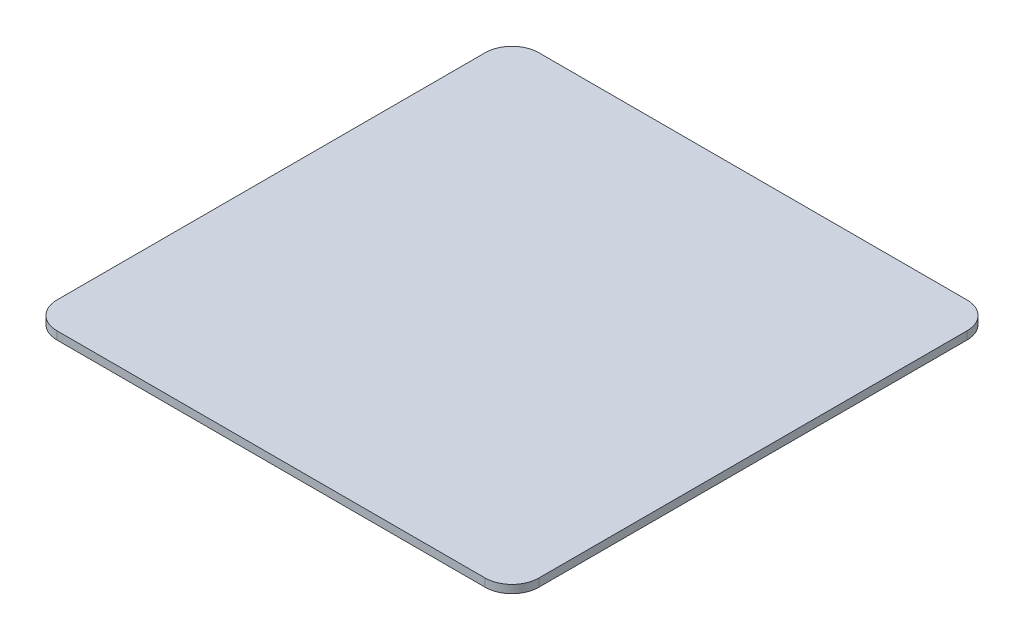
ISO-10303-21;
HEADER;
FILE_DESCRIPTION(('STEP AP214'),'2;1');
FILE_NAME('part.step','',(''),(''),'','','');
FILE_SCHEMA(('AUTOMOTIVE_DESIGN { 1 0 10303 214 1 1 1 1 }'));
ENDSEC;
DATA;
#1=APPLICATION_CONTEXT('core data for automotive mechanical design processes');
#2=APPLICATION_PROTOCOL_DEFINITION('international standard','automotive_design',2000,#1);
#3=PRODUCT_CONTEXT('',#1,'mechanical');
#4=PRODUCT('Part','Part','',(#3));
#5=PRODUCT_RELATED_PRODUCT_CATEGORY('part','',(#4));
#6=PRODUCT_DEFINITION_FORMATION('','',#4);
#7=PRODUCT_DEFINITION_CONTEXT('part definition',#1,'design');
#8=PRODUCT_DEFINITION('design','',#6,#7);
#9=PRODUCT_DEFINITION_SHAPE('','',#8);
#10=(LENGTH_UNIT() NAMED_UNIT(*) SI_UNIT(.MILLI.,.METRE.));
#11=(NAMED_UNIT(*) PLANE_ANGLE_UNIT() SI_UNIT($,.RADIAN.));
#12=(NAMED_UNIT(*) SI_UNIT($,.STERADIAN.) SOLID_ANGLE_UNIT());
#13=UNCERTAINTY_MEASURE_WITH_UNIT(LENGTH_MEASURE(1.E-05),#10,'distance_accuracy_value','');
#14=(GEOMETRIC_REPRESENTATION_CONTEXT(3) GLOBAL_UNCERTAINTY_ASSIGNED_CONTEXT((#13)) GLOBAL_UNIT_ASSIGNED_CONTEXT((#10,
#11,#12)) REPRESENTATION_CONTEXT('',''));
#15=CARTESIAN_POINT('',(0.,0.,0.));
#16=DIRECTION('',(0.,0.,1.));
#17=DIRECTION('',(1.,0.,0.));
#18=AXIS2_PLACEMENT_3D('',#15,#16,#17);
#19=CARTESIAN_POINT('',(90.,3.,-90.));
#20=DIRECTION('',(-1.,0.,0.));
#21=DIRECTION('',(0.,0.,1.));
#22=AXIS2_PLACEMENT_3D('',#19,#20,#21);
#23=PLANE('',#22);
#24=DIRECTION('',(0.,0.,-1.));
#25=VECTOR('',#24,1.);
#26=CARTESIAN_POINT('',(90.,0.,-90.));
#27=LINE('',#26,#25);
#28=CARTESIAN_POINT('',(90.,0.,79.9999999999999));
#29=VERTEX_POINT('',#28);
#30=CARTESIAN_POINT('',(90.,0.,-80.));
#31=VERTEX_POINT('',#30);
#32=EDGE_CURVE('E126',#29,#31,#27,.T.);
#33=ORIENTED_EDGE('',*,*,#32,.T.);
#34=DIRECTION('',(0.,-1.,0.));
#35=VECTOR('',#34,1.);
#36=CARTESIAN_POINT('',(90.,3.,-80.));
#37=LINE('',#36,#35);
#38=CARTESIAN_POINT('',(90.,3.,-80.));
#39=VERTEX_POINT('',#38);
#40=EDGE_CURVE('E104',#31,#39,#37,.F.);
#41=ORIENTED_EDGE('',*,*,#40,.T.);
#42=DIRECTION('',(0.,0.,-1.));
#43=VECTOR('',#42,1.);
#44=CARTESIAN_POINT('',(90.,3.,-90.));
#45=LINE('',#44,#43);
#46=CARTESIAN_POINT('',(90.,3.,79.9999999999999));
#47=VERTEX_POINT('',#46);
#48=EDGE_CURVE('E135',#47,#39,#45,.T.);
#49=ORIENTED_EDGE('',*,*,#48,.F.);
#50=DIRECTION('',(0.,-1.,0.));
#51=VECTOR('',#50,1.);
#52=CARTESIAN_POINT('',(90.,3.,80.));
#53=LINE('',#52,#51);
#54=EDGE_CURVE('E109',#47,#29,#53,.T.);
#55=ORIENTED_EDGE('',*,*,#54,.T.);
#56=EDGE_LOOP('',(#33,#41,#49,#55));
#57=FACE_BOUND('',#56,.T.);
#58=ADVANCED_FACE('F33',(#57),#23,.F.);
#59=CARTESIAN_POINT('',(-90.,3.,-90.));
#60=DIRECTION('',(0.,0.,1.));
#61=DIRECTION('',(1.,0.,0.));
#62=AXIS2_PLACEMENT_3D('',#59,#60,#61);
#63=PLANE('',#62);
#64=DIRECTION('',(-1.,0.,0.));
#65=VECTOR('',#64,1.);
#66=CARTESIAN_POINT('',(-90.,3.,-90.));
#67=LINE('',#66,#65);
#68=CARTESIAN_POINT('',(79.9999999999999,3.,-90.));
#69=VERTEX_POINT('',#68);
#70=CARTESIAN_POINT('',(-80.,3.,-90.));
#71=VERTEX_POINT('',#70);
#72=EDGE_CURVE('E119',#69,#71,#67,.T.);
#73=ORIENTED_EDGE('',*,*,#72,.F.);
#74=DIRECTION('',(0.,-1.,0.));
#75=VECTOR('',#74,1.);
#76=CARTESIAN_POINT('',(80.,3.,-90.));
#77=LINE('',#76,#75);
#78=CARTESIAN_POINT('',(79.9999999999999,0.,-90.));
#79=VERTEX_POINT('',#78);
#80=EDGE_CURVE('E103',#69,#79,#77,.T.);
#81=ORIENTED_EDGE('',*,*,#80,.T.);
#82=DIRECTION('',(-1.,0.,0.));
#83=VECTOR('',#82,1.);
#84=CARTESIAN_POINT('',(-90.,0.,-90.));
#85=LINE('',#84,#83);
#86=CARTESIAN_POINT('',(-80.,0.,-90.));
#87=VERTEX_POINT('',#86);
#88=EDGE_CURVE('E116',#79,#87,#85,.T.);
#89=ORIENTED_EDGE('',*,*,#88,.T.);
#90=DIRECTION('',(0.,-1.,0.));
#91=VECTOR('',#90,1.);
#92=CARTESIAN_POINT('',(-80.,3.,-90.));
#93=LINE('',#92,#91);
#94=EDGE_CURVE('E121',#87,#71,#93,.F.);
#95=ORIENTED_EDGE('',*,*,#94,.T.);
#96=EDGE_LOOP('',(#73,#81,#89,#95));
#97=FACE_BOUND('',#96,.T.);
#98=ADVANCED_FACE('F115',(#97),#63,.F.);
#99=CARTESIAN_POINT('',(-90.,3.,-90.));
#100=DIRECTION('',(1.,0.,0.));
#101=DIRECTION('',(0.,0.,-1.));
#102=AXIS2_PLACEMENT_3D('',#99,#100,#101);
#103=PLANE('',#102);
#104=DIRECTION('',(0.,0.,1.));
#105=VECTOR('',#104,1.);
#106=CARTESIAN_POINT('',(-90.,0.,-90.));
#107=LINE('',#106,#105);
#108=CARTESIAN_POINT('',(-90.,0.,-80.));
#109=VERTEX_POINT('',#108);
#110=CARTESIAN_POINT('',(-90.,0.,79.9999999999999));
#111=VERTEX_POINT('',#110);
#112=EDGE_CURVE('E125',#109,#111,#107,.T.);
#113=ORIENTED_EDGE('',*,*,#112,.T.);
#114=DIRECTION('',(0.,-1.,0.));
#115=VECTOR('',#114,1.);
#116=CARTESIAN_POINT('',(-90.,3.,80.));
#117=LINE('',#116,#115);
#118=CARTESIAN_POINT('',(-90.,3.,79.9999999999999));
#119=VERTEX_POINT('',#118);
#120=EDGE_CURVE('E11',#111,#119,#117,.F.);
#121=ORIENTED_EDGE('',*,*,#120,.T.);
#122=DIRECTION('',(0.,0.,1.));
#123=VECTOR('',#122,1.);
#124=CARTESIAN_POINT('',(-90.,3.,-90.));
#125=LINE('',#124,#123);
#126=CARTESIAN_POINT('',(-90.,3.,-80.));
#127=VERTEX_POINT('',#126);
#128=EDGE_CURVE('E161',#127,#119,#125,.T.);
#129=ORIENTED_EDGE('',*,*,#128,.F.);
#130=DIRECTION('',(0.,-1.,0.));
#131=VECTOR('',#130,1.);
#132=CARTESIAN_POINT('',(-90.,3.,-80.));
#133=LINE('',#132,#131);
#134=EDGE_CURVE('E41',#127,#109,#133,.T.);
#135=ORIENTED_EDGE('',*,*,#134,.T.);
#136=EDGE_LOOP('',(#113,#121,#129,#135));
#137=FACE_BOUND('',#136,.T.);
#138=ADVANCED_FACE('F159',(#137),#103,.F.);
#139=CARTESIAN_POINT('',(-90.,3.,90.));
#140=DIRECTION('',(0.,0.,-1.));
#141=DIRECTION('',(-1.,0.,0.));
#142=AXIS2_PLACEMENT_3D('',#139,#140,#141);
#143=PLANE('',#142);
#144=DIRECTION('',(1.,0.,0.));
#145=VECTOR('',#144,1.);
#146=CARTESIAN_POINT('',(-90.,0.,90.));
#147=LINE('',#146,#145);
#148=CARTESIAN_POINT('',(-80.,0.,90.));
#149=VERTEX_POINT('',#148);
#150=CARTESIAN_POINT('',(80.,0.,90.));
#151=VERTEX_POINT('',#150);
#152=EDGE_CURVE('E129',#149,#151,#147,.T.);
#153=ORIENTED_EDGE('',*,*,#152,.T.);
#154=DIRECTION('',(0.,-1.,0.));
#155=VECTOR('',#154,1.);
#156=CARTESIAN_POINT('',(80.,3.,90.));
#157=LINE('',#156,#155);
#158=CARTESIAN_POINT('',(80.,3.,90.));
#159=VERTEX_POINT('',#158);
#160=EDGE_CURVE('E48',#151,#159,#157,.F.);
#161=ORIENTED_EDGE('',*,*,#160,.T.);
#162=DIRECTION('',(1.,0.,0.));
#163=VECTOR('',#162,1.);
#164=CARTESIAN_POINT('',(-90.,3.,90.));
#165=LINE('',#164,#163);
#166=CARTESIAN_POINT('',(-80.,3.,90.));
#167=VERTEX_POINT('',#166);
#168=EDGE_CURVE('E136',#167,#159,#165,.T.);
#169=ORIENTED_EDGE('',*,*,#168,.F.);
#170=DIRECTION('',(0.,-1.,0.));
#171=VECTOR('',#170,1.);
#172=CARTESIAN_POINT('',(-80.,3.,90.));
#173=LINE('',#172,#171);
#174=EDGE_CURVE('E152',#167,#149,#173,.T.);
#175=ORIENTED_EDGE('',*,*,#174,.T.);
#176=EDGE_LOOP('',(#153,#161,#169,#175));
#177=FACE_BOUND('',#176,.T.);
#178=ADVANCED_FACE('F168',(#177),#143,.F.);
#179=CARTESIAN_POINT('',(0.,3.,0.));
#180=DIRECTION('',(0.,1.,0.));
#181=DIRECTION('',(0.,0.,1.));
#182=AXIS2_PLACEMENT_3D('',#179,#180,#181);
#183=PLANE('',#182);
#184=ORIENTED_EDGE('',*,*,#48,.T.);
#185=CARTESIAN_POINT('',(80.,3.,-80.));
#186=DIRECTION('',(0.,1.,0.));
#187=DIRECTION('',(0.,0.,1.));
#188=AXIS2_PLACEMENT_3D('',#185,#186,#187);
#189=CIRCLE('',#188,10.);
#190=EDGE_CURVE('E150',#39,#69,#189,.T.);
#191=ORIENTED_EDGE('',*,*,#190,.T.);
#192=ORIENTED_EDGE('',*,*,#72,.T.);
#193=CARTESIAN_POINT('',(-80.,3.,-80.));
#194=DIRECTION('',(0.,1.,0.));
#195=DIRECTION('',(0.,0.,1.));
#196=AXIS2_PLACEMENT_3D('',#193,#194,#195);
#197=CIRCLE('',#196,10.);
#198=EDGE_CURVE('E145',#71,#127,#197,.T.);
#199=ORIENTED_EDGE('',*,*,#198,.T.);
#200=ORIENTED_EDGE('',*,*,#128,.T.);
#201=CARTESIAN_POINT('',(-80.,3.,80.));
#202=DIRECTION('',(0.,1.,0.));
#203=DIRECTION('',(0.,0.,1.));
#204=AXIS2_PLACEMENT_3D('',#201,#202,#203);
#205=CIRCLE('',#204,10.);
#206=EDGE_CURVE('E55',#119,#167,#205,.T.);
#207=ORIENTED_EDGE('',*,*,#206,.T.);
#208=ORIENTED_EDGE('',*,*,#168,.T.);
#209=CARTESIAN_POINT('',(80.,3.,80.));
#210=DIRECTION('',(0.,1.,0.));
#211=DIRECTION('',(0.,0.,1.));
#212=AXIS2_PLACEMENT_3D('',#209,#210,#211);
#213=CIRCLE('',#212,10.);
#214=EDGE_CURVE('E148',#159,#47,#213,.T.);
#215=ORIENTED_EDGE('',*,*,#214,.T.);
#216=EDGE_LOOP('',(#184,#191,#192,#199,#200,#207,#208,#215));
#217=FACE_BOUND('',#216,.T.);
#218=ADVANCED_FACE('F175',(#217),#183,.T.);
#219=CARTESIAN_POINT('',(0.,0.,0.));
#220=DIRECTION('',(0.,1.,0.));
#221=DIRECTION('',(0.,0.,1.));
#222=AXIS2_PLACEMENT_3D('',#219,#220,#221);
#223=PLANE('',#222);
#224=ORIENTED_EDGE('',*,*,#88,.F.);
#225=CARTESIAN_POINT('',(80.,0.,-80.));
#226=DIRECTION('',(0.,1.,0.));
#227=DIRECTION('',(0.,0.,1.));
#228=AXIS2_PLACEMENT_3D('',#225,#226,#227);
#229=CIRCLE('',#228,10.);
#230=EDGE_CURVE('E99',#79,#31,#229,.F.);
#231=ORIENTED_EDGE('',*,*,#230,.T.);
#232=ORIENTED_EDGE('',*,*,#32,.F.);
#233=CARTESIAN_POINT('',(80.,0.,80.));
#234=DIRECTION('',(0.,1.,0.));
#235=DIRECTION('',(0.,0.,1.));
#236=AXIS2_PLACEMENT_3D('',#233,#234,#235);
#237=CIRCLE('',#236,10.);
#238=EDGE_CURVE('E110',#29,#151,#237,.F.);
#239=ORIENTED_EDGE('',*,*,#238,.T.);
#240=ORIENTED_EDGE('',*,*,#152,.F.);
#241=CARTESIAN_POINT('',(-80.,0.,80.));
#242=DIRECTION('',(0.,1.,0.));
#243=DIRECTION('',(0.,0.,1.));
#244=AXIS2_PLACEMENT_3D('',#241,#242,#243);
#245=CIRCLE('',#244,10.);
#246=EDGE_CURVE('E139',#149,#111,#245,.F.);
#247=ORIENTED_EDGE('',*,*,#246,.T.);
#248=ORIENTED_EDGE('',*,*,#112,.F.);
#249=CARTESIAN_POINT('',(-80.,0.,-80.));
#250=DIRECTION('',(0.,1.,0.));
#251=DIRECTION('',(0.,0.,1.));
#252=AXIS2_PLACEMENT_3D('',#249,#250,#251);
#253=CIRCLE('',#252,10.);
#254=EDGE_CURVE('E120',#109,#87,#253,.F.);
#255=ORIENTED_EDGE('',*,*,#254,.T.);
#256=EDGE_LOOP('',(#224,#231,#232,#239,#240,#247,#248,#255));
#257=FACE_BOUND('',#256,.T.);
#258=ADVANCED_FACE('F123',(#257),#223,.F.);
#259=CARTESIAN_POINT('',(80.,3.,-80.));
#260=DIRECTION('',(0.,-1.,0.));
#261=DIRECTION('',(0.,0.,-1.));
#262=AXIS2_PLACEMENT_3D('',#259,#260,#261);
#263=CYLINDRICAL_SURFACE('',#262,10.);
#264=ORIENTED_EDGE('',*,*,#190,.F.);
#265=ORIENTED_EDGE('',*,*,#40,.F.);
#266=ORIENTED_EDGE('',*,*,#230,.F.);
#267=ORIENTED_EDGE('',*,*,#80,.F.);
#268=EDGE_LOOP('',(#264,#265,#266,#267));
#269=FACE_BOUND('',#268,.T.);
#270=ADVANCED_FACE('F102',(#269),#263,.T.);
#271=CARTESIAN_POINT('',(80.,3.,80.));
#272=DIRECTION('',(0.,-1.,0.));
#273=DIRECTION('',(0.,0.,-1.));
#274=AXIS2_PLACEMENT_3D('',#271,#272,#273);
#275=CYLINDRICAL_SURFACE('',#274,10.);
#276=ORIENTED_EDGE('',*,*,#214,.F.);
#277=ORIENTED_EDGE('',*,*,#160,.F.);
#278=ORIENTED_EDGE('',*,*,#238,.F.);
#279=ORIENTED_EDGE('',*,*,#54,.F.);
#280=EDGE_LOOP('',(#276,#277,#278,#279));
#281=FACE_BOUND('',#280,.T.);
#282=ADVANCED_FACE('F179',(#281),#275,.T.);
#283=CARTESIAN_POINT('',(-80.,3.,80.));
#284=DIRECTION('',(0.,-1.,0.));
#285=DIRECTION('',(0.,0.,-1.));
#286=AXIS2_PLACEMENT_3D('',#283,#284,#285);
#287=CYLINDRICAL_SURFACE('',#286,10.);
#288=ORIENTED_EDGE('',*,*,#206,.F.);
#289=ORIENTED_EDGE('',*,*,#120,.F.);
#290=ORIENTED_EDGE('',*,*,#246,.F.);
#291=ORIENTED_EDGE('',*,*,#174,.F.);
#292=EDGE_LOOP('',(#288,#289,#290,#291));
#293=FACE_BOUND('',#292,.T.);
#294=ADVANCED_FACE('F167',(#293),#287,.T.);
#295=CARTESIAN_POINT('',(-80.,3.,-80.));
#296=DIRECTION('',(0.,-1.,0.));
#297=DIRECTION('',(0.,0.,-1.));
#298=AXIS2_PLACEMENT_3D('',#295,#296,#297);
#299=CYLINDRICAL_SURFACE('',#298,10.);
#300=ORIENTED_EDGE('',*,*,#198,.F.);
#301=ORIENTED_EDGE('',*,*,#94,.F.);
#302=ORIENTED_EDGE('',*,*,#254,.F.);
#303=ORIENTED_EDGE('',*,*,#134,.F.);
#304=EDGE_LOOP('',(#300,#301,#302,#303));
#305=FACE_BOUND('',#304,.T.);
#306=ADVANCED_FACE('F35',(#305),#299,.T.);
#307=CLOSED_SHELL('',(#58,#98,#138,#178,#218,#258,#270,#282,#294,#306));
#308=MANIFOLD_SOLID_BREP('B2',#307);
#309=ADVANCED_BREP_SHAPE_REPRESENTATION('',(#18,#308),#14);
#310=SHAPE_DEFINITION_REPRESENTATION(#9,#309);
ENDSEC;
END-ISO-10303-21;
